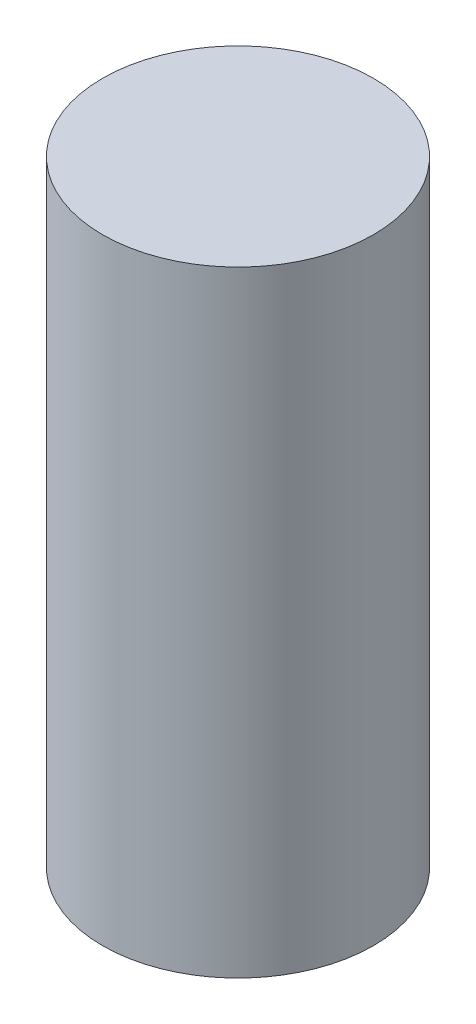
ISO-10303-21;
HEADER;
FILE_DESCRIPTION(('STEP AP214'),'2;1');
FILE_NAME('part.step','',(''),(''),'','','');
FILE_SCHEMA(('AUTOMOTIVE_DESIGN { 1 0 10303 214 1 1 1 1 }'));
ENDSEC;
DATA;
#1=APPLICATION_CONTEXT('core data for automotive mechanical design processes');
#2=APPLICATION_PROTOCOL_DEFINITION('international standard','automotive_design',2000,#1);
#3=PRODUCT_CONTEXT('',#1,'mechanical');
#4=PRODUCT('Part','Part','',(#3));
#5=PRODUCT_RELATED_PRODUCT_CATEGORY('part','',(#4));
#6=PRODUCT_DEFINITION_FORMATION('','',#4);
#7=PRODUCT_DEFINITION_CONTEXT('part definition',#1,'design');
#8=PRODUCT_DEFINITION('design','',#6,#7);
#9=PRODUCT_DEFINITION_SHAPE('','',#8);
#10=(LENGTH_UNIT() NAMED_UNIT(*) SI_UNIT(.MILLI.,.METRE.));
#11=(NAMED_UNIT(*) PLANE_ANGLE_UNIT() SI_UNIT($,.RADIAN.));
#12=(NAMED_UNIT(*) SI_UNIT($,.STERADIAN.) SOLID_ANGLE_UNIT());
#13=UNCERTAINTY_MEASURE_WITH_UNIT(LENGTH_MEASURE(1.E-05),#10,'distance_accuracy_value','');
#14=(GEOMETRIC_REPRESENTATION_CONTEXT(3) GLOBAL_UNCERTAINTY_ASSIGNED_CONTEXT((#13)) GLOBAL_UNIT_ASSIGNED_CONTEXT((#10,
#11,#12)) REPRESENTATION_CONTEXT('',''));
#15=CARTESIAN_POINT('',(0.,0.,0.));
#16=DIRECTION('',(0.,0.,1.));
#17=DIRECTION('',(1.,0.,0.));
#18=AXIS2_PLACEMENT_3D('',#15,#16,#17);
#19=CARTESIAN_POINT('',(0.,50.,0.));
#20=DIRECTION('',(0.,-1.,0.));
#21=DIRECTION('',(0.,0.,-1.));
#22=AXIS2_PLACEMENT_3D('',#19,#20,#21);
#23=CYLINDRICAL_SURFACE('',#22,11.);
#24=CARTESIAN_POINT('',(0.,50.,0.));
#25=DIRECTION('',(0.,1.,0.));
#26=DIRECTION('',(0.,0.,1.));
#27=AXIS2_PLACEMENT_3D('',#24,#25,#26);
#28=CIRCLE('',#27,11.);
#29=CARTESIAN_POINT('',(0.,50.,11.));
#30=VERTEX_POINT('',#29);
#31=EDGE_CURVE('E10',#30,#30,#28,.T.);
#32=ORIENTED_EDGE('',*,*,#31,.F.);
#33=EDGE_LOOP('',(#32));
#34=FACE_BOUND('',#33,.T.);
#35=CARTESIAN_POINT('',(0.,0.,0.));
#36=DIRECTION('',(0.,1.,0.));
#37=DIRECTION('',(0.,0.,1.));
#38=AXIS2_PLACEMENT_3D('',#35,#36,#37);
#39=CIRCLE('',#38,11.);
#40=CARTESIAN_POINT('',(0.,0.,11.));
#41=VERTEX_POINT('',#40);
#42=EDGE_CURVE('E40',#41,#41,#39,.T.);
#43=ORIENTED_EDGE('',*,*,#42,.T.);
#44=EDGE_LOOP('',(#43));
#45=FACE_BOUND('',#44,.T.);
#46=ADVANCED_FACE('F37',(#34,#45),#23,.T.);
#47=CARTESIAN_POINT('',(0.,50.,0.));
#48=DIRECTION('',(0.,1.,0.));
#49=DIRECTION('',(0.,0.,1.));
#50=AXIS2_PLACEMENT_3D('',#47,#48,#49);
#51=PLANE('',#50);
#52=ORIENTED_EDGE('',*,*,#31,.T.);
#53=EDGE_LOOP('',(#52));
#54=FACE_BOUND('',#53,.T.);
#55=ADVANCED_FACE('F52',(#54),#51,.T.);
#56=CARTESIAN_POINT('',(0.,0.,0.));
#57=DIRECTION('',(0.,1.,0.));
#58=DIRECTION('',(0.,0.,1.));
#59=AXIS2_PLACEMENT_3D('',#56,#57,#58);
#60=PLANE('',#59);
#61=ORIENTED_EDGE('',*,*,#42,.F.);
#62=EDGE_LOOP('',(#61));
#63=FACE_BOUND('',#62,.T.);
#64=ADVANCED_FACE('F50',(#63),#60,.F.);
#65=CLOSED_SHELL('',(#46,#55,#64));
#66=MANIFOLD_SOLID_BREP('B2',#65);
#67=ADVANCED_BREP_SHAPE_REPRESENTATION('',(#18,#66),#14);
#68=SHAPE_DEFINITION_REPRESENTATION(#9,#67);
ENDSEC;
END-ISO-10303-21;
